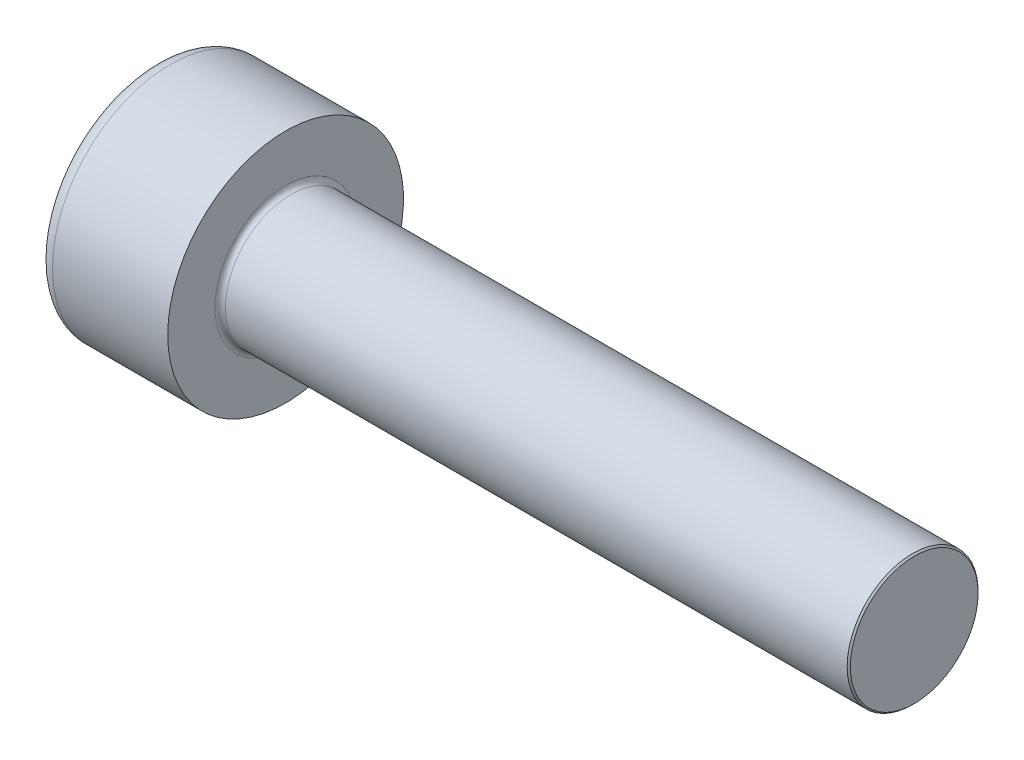
ISO-10303-21;
HEADER;
FILE_DESCRIPTION(('STEP AP214'),'2;1');
FILE_NAME('part.step','',(''),(''),'','','');
FILE_SCHEMA(('AUTOMOTIVE_DESIGN { 1 0 10303 214 1 1 1 1 }'));
ENDSEC;
DATA;
#1=APPLICATION_CONTEXT('core data for automotive mechanical design processes');
#2=APPLICATION_PROTOCOL_DEFINITION('international standard','automotive_design',2000,#1);
#3=PRODUCT_CONTEXT('',#1,'mechanical');
#4=PRODUCT('Part','Part','',(#3));
#5=PRODUCT_RELATED_PRODUCT_CATEGORY('part','',(#4));
#6=PRODUCT_DEFINITION_FORMATION('','',#4);
#7=PRODUCT_DEFINITION_CONTEXT('part definition',#1,'design');
#8=PRODUCT_DEFINITION('design','',#6,#7);
#9=PRODUCT_DEFINITION_SHAPE('','',#8);
#10=(LENGTH_UNIT() NAMED_UNIT(*) SI_UNIT(.MILLI.,.METRE.));
#11=(NAMED_UNIT(*) PLANE_ANGLE_UNIT() SI_UNIT($,.RADIAN.));
#12=(NAMED_UNIT(*) SI_UNIT($,.STERADIAN.) SOLID_ANGLE_UNIT());
#13=UNCERTAINTY_MEASURE_WITH_UNIT(LENGTH_MEASURE(1.E-05),#10,'distance_accuracy_value','');
#14=(GEOMETRIC_REPRESENTATION_CONTEXT(3) GLOBAL_UNCERTAINTY_ASSIGNED_CONTEXT((#13)) GLOBAL_UNIT_ASSIGNED_CONTEXT((#10,
#11,#12)) REPRESENTATION_CONTEXT('',''));
#15=CARTESIAN_POINT('',(0.,0.,0.));
#16=DIRECTION('',(0.,0.,1.));
#17=DIRECTION('',(1.,0.,0.));
#18=AXIS2_PLACEMENT_3D('',#15,#16,#17);
#19=CARTESIAN_POINT('',(0.,0.,0.));
#20=DIRECTION('',(-1.,0.,0.));
#21=DIRECTION('',(0.,0.,1.));
#22=AXIS2_PLACEMENT_3D('',#19,#20,#21);
#23=PLANE('',#22);
#24=DIRECTION('',(0.,-0.499999999999999,0.866025403784439));
#25=VECTOR('',#24,1.);
#26=CARTESIAN_POINT('',(0.,1.15470053837925,0.));
#27=LINE('',#26,#25);
#28=CARTESIAN_POINT('',(0.,1.15470053837925,0.));
#29=VERTEX_POINT('',#28);
#30=CARTESIAN_POINT('',(0.,0.577350269189622,0.999999999999997));
#31=VERTEX_POINT('',#30);
#32=EDGE_CURVE('E265',#29,#31,#27,.T.);
#33=ORIENTED_EDGE('',*,*,#32,.T.);
#34=DIRECTION('',(0.,1.,0.));
#35=VECTOR('',#34,1.);
#36=CARTESIAN_POINT('',(0.,-0.57735026918963,0.999999999999999));
#37=LINE('',#36,#35);
#38=CARTESIAN_POINT('',(0.,-0.57735026918963,0.999999999999999));
#39=VERTEX_POINT('',#38);
#40=EDGE_CURVE('E137',#39,#31,#37,.T.);
#41=ORIENTED_EDGE('',*,*,#40,.F.);
#42=DIRECTION('',(0.,-0.500000000000001,-0.866025403784438));
#43=VECTOR('',#42,1.);
#44=CARTESIAN_POINT('',(0.,-0.57735026918963,0.999999999999999));
#45=LINE('',#44,#43);
#46=CARTESIAN_POINT('',(0.,-1.15470053837926,0.));
#47=VERTEX_POINT('',#46);
#48=EDGE_CURVE('E268',#39,#47,#45,.T.);
#49=ORIENTED_EDGE('',*,*,#48,.T.);
#50=DIRECTION('',(0.,0.499999999999999,-0.866025403784439));
#51=VECTOR('',#50,1.);
#52=CARTESIAN_POINT('',(0.,-1.15470053837926,0.));
#53=LINE('',#52,#51);
#54=CARTESIAN_POINT('',(0.,-0.577350269189632,-1.));
#55=VERTEX_POINT('',#54);
#56=EDGE_CURVE('E271',#47,#55,#53,.T.);
#57=ORIENTED_EDGE('',*,*,#56,.T.);
#58=DIRECTION('',(0.,-1.,0.));
#59=VECTOR('',#58,1.);
#60=CARTESIAN_POINT('',(0.,0.577350269189619,-1.));
#61=LINE('',#60,#59);
#62=CARTESIAN_POINT('',(0.,0.577350269189619,-1.));
#63=VERTEX_POINT('',#62);
#64=EDGE_CURVE('E274',#63,#55,#61,.T.);
#65=ORIENTED_EDGE('',*,*,#64,.F.);
#66=DIRECTION('',(0.,-0.500000000000001,-0.866025403784438));
#67=VECTOR('',#66,1.);
#68=CARTESIAN_POINT('',(0.,1.15470053837925,0.));
#69=LINE('',#68,#67);
#70=EDGE_CURVE('E132',#29,#63,#69,.T.);
#71=ORIENTED_EDGE('',*,*,#70,.F.);
#72=EDGE_LOOP('',(#33,#41,#49,#57,#65,#71));
#73=FACE_BOUND('',#72,.T.);
#74=CARTESIAN_POINT('',(0.,0.,0.));
#75=DIRECTION('',(-1.,0.,0.));
#76=DIRECTION('',(0.,0.,1.));
#77=AXIS2_PLACEMENT_3D('',#74,#75,#76);
#78=CIRCLE('',#77,1.95);
#79=CARTESIAN_POINT('',(0.,0.,1.95));
#80=VERTEX_POINT('',#79);
#81=EDGE_CURVE('E49',#80,#80,#78,.T.);
#82=ORIENTED_EDGE('',*,*,#81,.T.);
#83=EDGE_LOOP('',(#82));
#84=FACE_BOUND('',#83,.T.);
#85=ADVANCED_FACE('F41',(#73,#84),#23,.T.);
#86=CARTESIAN_POINT('',(-31.75,0.,0.));
#87=DIRECTION('',(-1.,0.,0.));
#88=DIRECTION('',(0.,0.,1.));
#89=AXIS2_PLACEMENT_3D('',#86,#87,#88);
#90=CYLINDRICAL_SURFACE('',#89,2.25);
#91=CARTESIAN_POINT('',(0.300000000000002,0.,0.));
#92=DIRECTION('',(-1.,0.,0.));
#93=DIRECTION('',(0.,0.,1.));
#94=AXIS2_PLACEMENT_3D('',#91,#92,#93);
#95=CIRCLE('',#94,2.25);
#96=CARTESIAN_POINT('',(0.300000000000002,0.,2.25));
#97=VERTEX_POINT('',#96);
#98=EDGE_CURVE('E11',#97,#97,#95,.F.);
#99=ORIENTED_EDGE('',*,*,#98,.T.);
#100=EDGE_LOOP('',(#99));
#101=FACE_BOUND('',#100,.T.);
#102=CARTESIAN_POINT('',(2.5,0.,0.));
#103=DIRECTION('',(-1.,0.,0.));
#104=DIRECTION('',(0.,0.,1.));
#105=AXIS2_PLACEMENT_3D('',#102,#103,#104);
#106=CIRCLE('',#105,2.25);
#107=CARTESIAN_POINT('',(2.5,0.,2.25));
#108=VERTEX_POINT('',#107);
#109=EDGE_CURVE('E155',#108,#108,#106,.T.);
#110=ORIENTED_EDGE('',*,*,#109,.T.);
#111=EDGE_LOOP('',(#110));
#112=FACE_BOUND('',#111,.T.);
#113=ADVANCED_FACE('F180',(#101,#112),#90,.T.);
#114=CARTESIAN_POINT('',(2.5,2.25,0.));
#115=DIRECTION('',(1.,0.,0.));
#116=DIRECTION('',(0.,0.,-1.));
#117=AXIS2_PLACEMENT_3D('',#114,#115,#116);
#118=PLANE('',#117);
#119=CARTESIAN_POINT('',(2.5,0.,0.));
#120=DIRECTION('',(1.,0.,0.));
#121=DIRECTION('',(0.,0.,-1.));
#122=AXIS2_PLACEMENT_3D('',#119,#120,#121);
#123=CIRCLE('',#122,1.34999999999998);
#124=CARTESIAN_POINT('',(2.5,0.,-1.34999999999998));
#125=VERTEX_POINT('',#124);
#126=EDGE_CURVE('E158',#125,#125,#123,.F.);
#127=ORIENTED_EDGE('',*,*,#126,.T.);
#128=EDGE_LOOP('',(#127));
#129=FACE_BOUND('',#128,.T.);
#130=ORIENTED_EDGE('',*,*,#109,.F.);
#131=EDGE_LOOP('',(#130));
#132=FACE_BOUND('',#131,.T.);
#133=ADVANCED_FACE('F185',(#129,#132),#118,.T.);
#134=CARTESIAN_POINT('',(-31.75,0.,0.));
#135=DIRECTION('',(-1.,0.,0.));
#136=DIRECTION('',(0.,0.,1.));
#137=AXIS2_PLACEMENT_3D('',#134,#135,#136);
#138=CYLINDRICAL_SURFACE('',#137,1.24999999999998);
#139=CARTESIAN_POINT('',(2.6,0.,0.));
#140=DIRECTION('',(1.,0.,0.));
#141=DIRECTION('',(0.,0.,-1.));
#142=AXIS2_PLACEMENT_3D('',#139,#140,#141);
#143=CIRCLE('',#142,1.24999999999998);
#144=CARTESIAN_POINT('',(2.6,0.,-1.24999999999998));
#145=VERTEX_POINT('',#144);
#146=EDGE_CURVE('E161',#145,#145,#143,.T.);
#147=ORIENTED_EDGE('',*,*,#146,.T.);
#148=EDGE_LOOP('',(#147));
#149=FACE_BOUND('',#148,.T.);
#150=CARTESIAN_POINT('',(14.4695,0.,0.));
#151=DIRECTION('',(-1.,0.,0.));
#152=DIRECTION('',(0.,0.,1.));
#153=AXIS2_PLACEMENT_3D('',#150,#151,#152);
#154=CIRCLE('',#153,1.24999999999995);
#155=CARTESIAN_POINT('',(14.4695,0.,1.24999999999995));
#156=VERTEX_POINT('',#155);
#157=EDGE_CURVE('E152',#156,#156,#154,.T.);
#158=ORIENTED_EDGE('',*,*,#157,.T.);
#159=EDGE_LOOP('',(#158));
#160=FACE_BOUND('',#159,.T.);
#161=ADVANCED_FACE('F191',(#149,#160),#138,.T.);
#162=CARTESIAN_POINT('',(14.5,0.,0.));
#163=DIRECTION('',(-1.,0.,0.));
#164=DIRECTION('',(0.,0.,1.));
#165=AXIS2_PLACEMENT_3D('',#162,#163,#164);
#166=CONICAL_SURFACE('',#165,1.2195,0.785398163395916);
#167=ORIENTED_EDGE('',*,*,#157,.F.);
#168=EDGE_LOOP('',(#167));
#169=FACE_BOUND('',#168,.T.);
#170=CARTESIAN_POINT('',(14.5,0.,0.));
#171=DIRECTION('',(-1.,0.,0.));
#172=DIRECTION('',(0.,0.,1.));
#173=AXIS2_PLACEMENT_3D('',#170,#171,#172);
#174=CIRCLE('',#173,1.2195);
#175=CARTESIAN_POINT('',(14.5,0.,1.2195));
#176=VERTEX_POINT('',#175);
#177=EDGE_CURVE('E148',#176,#176,#174,.T.);
#178=ORIENTED_EDGE('',*,*,#177,.T.);
#179=EDGE_LOOP('',(#178));
#180=FACE_BOUND('',#179,.T.);
#181=ADVANCED_FACE('F195',(#169,#180),#166,.T.);
#182=CARTESIAN_POINT('',(14.5,1.2195,0.));
#183=DIRECTION('',(1.,0.,0.));
#184=DIRECTION('',(0.,0.,-1.));
#185=AXIS2_PLACEMENT_3D('',#182,#183,#184);
#186=PLANE('',#185);
#187=ORIENTED_EDGE('',*,*,#177,.F.);
#188=EDGE_LOOP('',(#187));
#189=FACE_BOUND('',#188,.T.);
#190=ADVANCED_FACE('F177',(#189),#186,.T.);
#191=CARTESIAN_POINT('',(2.6,0.,0.));
#192=DIRECTION('',(1.,0.,0.));
#193=DIRECTION('',(0.,0.,-1.));
#194=AXIS2_PLACEMENT_3D('',#191,#192,#193);
#195=TOROIDAL_SURFACE('',#194,1.34999999999998,0.1);
#196=ORIENTED_EDGE('',*,*,#146,.F.);
#197=EDGE_LOOP('',(#196));
#198=FACE_BOUND('',#197,.T.);
#199=ORIENTED_EDGE('',*,*,#126,.F.);
#200=EDGE_LOOP('',(#199));
#201=FACE_BOUND('',#200,.T.);
#202=ADVANCED_FACE('F168',(#198,#201),#195,.F.);
#203=CARTESIAN_POINT('',(0.300000000000002,0.,0.));
#204=DIRECTION('',(-1.,0.,0.));
#205=DIRECTION('',(0.,0.,1.));
#206=AXIS2_PLACEMENT_3D('',#203,#204,#205);
#207=TOROIDAL_SURFACE('',#206,1.95,0.3);
#208=ORIENTED_EDGE('',*,*,#98,.F.);
#209=EDGE_LOOP('',(#208));
#210=FACE_BOUND('',#209,.T.);
#211=ORIENTED_EDGE('',*,*,#81,.F.);
#212=EDGE_LOOP('',(#211));
#213=FACE_BOUND('',#212,.T.);
#214=ADVANCED_FACE('F43',(#210,#213),#207,.T.);
#215=CARTESIAN_POINT('',(1.3,1.15470053837925,0.));
#216=DIRECTION('',(0.,-0.866025403784439,-0.499999999999999));
#217=DIRECTION('',(0.,0.499999999999999,-0.866025403784439));
#218=AXIS2_PLACEMENT_3D('',#215,#216,#217);
#219=PLANE('',#218);
#220=ORIENTED_EDGE('',*,*,#32,.F.);
#221=DIRECTION('',(-1.,0.,0.));
#222=VECTOR('',#221,1.);
#223=CARTESIAN_POINT('',(1.3,1.15470053837925,0.));
#224=LINE('',#223,#222);
#225=CARTESIAN_POINT('',(1.3,1.15470053837925,0.));
#226=VERTEX_POINT('',#225);
#227=EDGE_CURVE('E255',#226,#29,#224,.T.);
#228=ORIENTED_EDGE('',*,*,#227,.F.);
#229=DIRECTION('',(0.,-0.499999999999999,0.866025403784439));
#230=VECTOR('',#229,1.);
#231=CARTESIAN_POINT('',(1.3,1.15470053837925,0.));
#232=LINE('',#231,#230);
#233=CARTESIAN_POINT('',(1.3,0.866025403784435,0.499999999999997));
#234=VERTEX_POINT('',#233);
#235=EDGE_CURVE('E124',#226,#234,#232,.T.);
#236=ORIENTED_EDGE('',*,*,#235,.T.);
#237=CARTESIAN_POINT('',(1.3,0.577350269189622,0.999999999999997));
#238=VERTEX_POINT('',#237);
#239=EDGE_CURVE('E115',#234,#238,#232,.T.);
#240=ORIENTED_EDGE('',*,*,#239,.T.);
#241=DIRECTION('',(-1.,0.,0.));
#242=VECTOR('',#241,1.);
#243=CARTESIAN_POINT('',(1.3,0.577350269189622,0.999999999999997));
#244=LINE('',#243,#242);
#245=EDGE_CURVE('E129',#238,#31,#244,.T.);
#246=ORIENTED_EDGE('',*,*,#245,.T.);
#247=EDGE_LOOP('',(#220,#228,#236,#240,#246));
#248=FACE_BOUND('',#247,.T.);
#249=ADVANCED_FACE('F128',(#248),#219,.T.);
#250=CARTESIAN_POINT('',(1.3,-0.57735026918963,0.999999999999999));
#251=DIRECTION('',(0.,0.,1.));
#252=DIRECTION('',(0.,-1.,0.));
#253=AXIS2_PLACEMENT_3D('',#250,#251,#252);
#254=PLANE('',#253);
#255=ORIENTED_EDGE('',*,*,#40,.T.);
#256=ORIENTED_EDGE('',*,*,#245,.F.);
#257=DIRECTION('',(0.,1.,0.));
#258=VECTOR('',#257,1.);
#259=CARTESIAN_POINT('',(1.3,-0.57735026918963,0.999999999999999));
#260=LINE('',#259,#258);
#261=CARTESIAN_POINT('',(1.3,0.,0.999999999999998));
#262=VERTEX_POINT('',#261);
#263=EDGE_CURVE('E112',#262,#238,#260,.T.);
#264=ORIENTED_EDGE('',*,*,#263,.F.);
#265=CARTESIAN_POINT('',(1.3,-0.57735026918963,0.999999999999999));
#266=VERTEX_POINT('',#265);
#267=EDGE_CURVE('E123',#266,#262,#260,.T.);
#268=ORIENTED_EDGE('',*,*,#267,.F.);
#269=DIRECTION('',(-1.,0.,0.));
#270=VECTOR('',#269,1.);
#271=CARTESIAN_POINT('',(1.3,-0.57735026918963,0.999999999999999));
#272=LINE('',#271,#270);
#273=EDGE_CURVE('E139',#266,#39,#272,.T.);
#274=ORIENTED_EDGE('',*,*,#273,.T.);
#275=EDGE_LOOP('',(#255,#256,#264,#268,#274));
#276=FACE_BOUND('',#275,.T.);
#277=ADVANCED_FACE('F134',(#276),#254,.F.);
#278=CARTESIAN_POINT('',(1.3,-0.57735026918963,0.999999999999999));
#279=DIRECTION('',(0.,0.866025403784438,-0.500000000000001));
#280=DIRECTION('',(0.,0.500000000000001,0.866025403784438));
#281=AXIS2_PLACEMENT_3D('',#278,#279,#280);
#282=PLANE('',#281);
#283=ORIENTED_EDGE('',*,*,#48,.F.);
#284=ORIENTED_EDGE('',*,*,#273,.F.);
#285=DIRECTION('',(0.,-0.500000000000001,-0.866025403784438));
#286=VECTOR('',#285,1.);
#287=CARTESIAN_POINT('',(1.3,-0.57735026918963,0.999999999999999));
#288=LINE('',#287,#286);
#289=CARTESIAN_POINT('',(1.3,-0.866025403784441,0.500000000000003));
#290=VERTEX_POINT('',#289);
#291=EDGE_CURVE('E294',#266,#290,#288,.T.);
#292=ORIENTED_EDGE('',*,*,#291,.T.);
#293=CARTESIAN_POINT('',(1.3,-1.15470053837926,0.));
#294=VERTEX_POINT('',#293);
#295=EDGE_CURVE('E283',#290,#294,#288,.T.);
#296=ORIENTED_EDGE('',*,*,#295,.T.);
#297=DIRECTION('',(-1.,0.,0.));
#298=VECTOR('',#297,1.);
#299=CARTESIAN_POINT('',(1.3,-1.15470053837926,0.));
#300=LINE('',#299,#298);
#301=EDGE_CURVE('E144',#294,#47,#300,.T.);
#302=ORIENTED_EDGE('',*,*,#301,.T.);
#303=EDGE_LOOP('',(#283,#284,#292,#296,#302));
#304=FACE_BOUND('',#303,.T.);
#305=ADVANCED_FACE('F209',(#304),#282,.T.);
#306=CARTESIAN_POINT('',(1.3,-1.15470053837926,0.));
#307=DIRECTION('',(0.,0.866025403784439,0.499999999999999));
#308=DIRECTION('',(0.,-0.499999999999999,0.866025403784439));
#309=AXIS2_PLACEMENT_3D('',#306,#307,#308);
#310=PLANE('',#309);
#311=ORIENTED_EDGE('',*,*,#56,.F.);
#312=ORIENTED_EDGE('',*,*,#301,.F.);
#313=DIRECTION('',(0.,0.499999999999999,-0.866025403784439));
#314=VECTOR('',#313,1.);
#315=CARTESIAN_POINT('',(1.3,-1.15470053837926,0.));
#316=LINE('',#315,#314);
#317=CARTESIAN_POINT('',(1.3,-0.866025403784444,-0.500000000000002));
#318=VERTEX_POINT('',#317);
#319=EDGE_CURVE('E261',#294,#318,#316,.T.);
#320=ORIENTED_EDGE('',*,*,#319,.T.);
#321=CARTESIAN_POINT('',(1.3,-0.577350269189632,-1.));
#322=VERTEX_POINT('',#321);
#323=EDGE_CURVE('E293',#318,#322,#316,.T.);
#324=ORIENTED_EDGE('',*,*,#323,.T.);
#325=DIRECTION('',(-1.,0.,0.));
#326=VECTOR('',#325,1.);
#327=CARTESIAN_POINT('',(1.3,-0.577350269189632,-1.));
#328=LINE('',#327,#326);
#329=EDGE_CURVE('E254',#322,#55,#328,.T.);
#330=ORIENTED_EDGE('',*,*,#329,.T.);
#331=EDGE_LOOP('',(#311,#312,#320,#324,#330));
#332=FACE_BOUND('',#331,.T.);
#333=ADVANCED_FACE('F212',(#332),#310,.T.);
#334=CARTESIAN_POINT('',(1.3,0.577350269189619,-1.));
#335=DIRECTION('',(0.,0.,-1.));
#336=DIRECTION('',(0.,1.,0.));
#337=AXIS2_PLACEMENT_3D('',#334,#335,#336);
#338=PLANE('',#337);
#339=ORIENTED_EDGE('',*,*,#64,.T.);
#340=ORIENTED_EDGE('',*,*,#329,.F.);
#341=DIRECTION('',(0.,-1.,0.));
#342=VECTOR('',#341,1.);
#343=CARTESIAN_POINT('',(1.3,0.577350269189619,-1.));
#344=LINE('',#343,#342);
#345=CARTESIAN_POINT('',(1.3,0.,-1.));
#346=VERTEX_POINT('',#345);
#347=EDGE_CURVE('E258',#346,#322,#344,.T.);
#348=ORIENTED_EDGE('',*,*,#347,.F.);
#349=CARTESIAN_POINT('',(1.3,0.577350269189619,-1.));
#350=VERTEX_POINT('',#349);
#351=EDGE_CURVE('E56',#350,#346,#344,.T.);
#352=ORIENTED_EDGE('',*,*,#351,.F.);
#353=DIRECTION('',(-1.,0.,0.));
#354=VECTOR('',#353,1.);
#355=CARTESIAN_POINT('',(1.3,0.577350269189619,-1.));
#356=LINE('',#355,#354);
#357=EDGE_CURVE('E251',#350,#63,#356,.T.);
#358=ORIENTED_EDGE('',*,*,#357,.T.);
#359=EDGE_LOOP('',(#339,#340,#348,#352,#358));
#360=FACE_BOUND('',#359,.T.);
#361=ADVANCED_FACE('F216',(#360),#338,.F.);
#362=CARTESIAN_POINT('',(1.3,1.15470053837925,0.));
#363=DIRECTION('',(0.,0.866025403784438,-0.500000000000001));
#364=DIRECTION('',(0.,0.500000000000001,0.866025403784438));
#365=AXIS2_PLACEMENT_3D('',#362,#363,#364);
#366=PLANE('',#365);
#367=ORIENTED_EDGE('',*,*,#70,.T.);
#368=ORIENTED_EDGE('',*,*,#357,.F.);
#369=DIRECTION('',(0.,-0.500000000000001,-0.866025403784438));
#370=VECTOR('',#369,1.);
#371=CARTESIAN_POINT('',(1.3,1.15470053837925,0.));
#372=LINE('',#371,#370);
#373=CARTESIAN_POINT('',(1.3,0.866025403784435,-0.5));
#374=VERTEX_POINT('',#373);
#375=EDGE_CURVE('E241',#374,#350,#372,.T.);
#376=ORIENTED_EDGE('',*,*,#375,.F.);
#377=EDGE_CURVE('E247',#226,#374,#372,.T.);
#378=ORIENTED_EDGE('',*,*,#377,.F.);
#379=ORIENTED_EDGE('',*,*,#227,.T.);
#380=EDGE_LOOP('',(#367,#368,#376,#378,#379));
#381=FACE_BOUND('',#380,.T.);
#382=ADVANCED_FACE('F220',(#381),#366,.F.);
#383=CARTESIAN_POINT('',(1.3,1.15470053837925,0.));
#384=DIRECTION('',(1.,0.,0.));
#385=DIRECTION('',(0.,0.,-1.));
#386=AXIS2_PLACEMENT_3D('',#383,#384,#385);
#387=PLANE('',#386);
#388=ORIENTED_EDGE('',*,*,#347,.T.);
#389=ORIENTED_EDGE('',*,*,#323,.F.);
#390=CARTESIAN_POINT('',(1.3,0.,0.));
#391=DIRECTION('',(-1.,0.,0.));
#392=DIRECTION('',(0.,0.,1.));
#393=AXIS2_PLACEMENT_3D('',#390,#391,#392);
#394=CIRCLE('',#393,1.);
#395=EDGE_CURVE('E289',#346,#318,#394,.T.);
#396=ORIENTED_EDGE('',*,*,#395,.F.);
#397=EDGE_LOOP('',(#388,#389,#396));
#398=FACE_BOUND('',#397,.T.);
#399=ADVANCED_FACE('F224',(#398),#387,.F.);
#400=ORIENTED_EDGE('',*,*,#319,.F.);
#401=ORIENTED_EDGE('',*,*,#295,.F.);
#402=EDGE_CURVE('E142',#318,#290,#394,.T.);
#403=ORIENTED_EDGE('',*,*,#402,.F.);
#404=EDGE_LOOP('',(#400,#401,#403));
#405=FACE_BOUND('',#404,.T.);
#406=ADVANCED_FACE('F227',(#405),#387,.F.);
#407=ORIENTED_EDGE('',*,*,#291,.F.);
#408=ORIENTED_EDGE('',*,*,#267,.T.);
#409=EDGE_CURVE('E138',#290,#262,#394,.T.);
#410=ORIENTED_EDGE('',*,*,#409,.F.);
#411=EDGE_LOOP('',(#407,#408,#410));
#412=FACE_BOUND('',#411,.T.);
#413=ADVANCED_FACE('F232',(#412),#387,.F.);
#414=ORIENTED_EDGE('',*,*,#263,.T.);
#415=ORIENTED_EDGE('',*,*,#239,.F.);
#416=EDGE_CURVE('E118',#262,#234,#394,.T.);
#417=ORIENTED_EDGE('',*,*,#416,.F.);
#418=EDGE_LOOP('',(#414,#415,#417));
#419=FACE_BOUND('',#418,.T.);
#420=ADVANCED_FACE('F114',(#419),#387,.F.);
#421=ORIENTED_EDGE('',*,*,#235,.F.);
#422=ORIENTED_EDGE('',*,*,#377,.T.);
#423=EDGE_CURVE('E149',#234,#374,#394,.T.);
#424=ORIENTED_EDGE('',*,*,#423,.F.);
#425=EDGE_LOOP('',(#421,#422,#424));
#426=FACE_BOUND('',#425,.T.);
#427=ADVANCED_FACE('F235',(#426),#387,.F.);
#428=ORIENTED_EDGE('',*,*,#375,.T.);
#429=ORIENTED_EDGE('',*,*,#351,.T.);
#430=EDGE_CURVE('E244',#374,#346,#394,.T.);
#431=ORIENTED_EDGE('',*,*,#430,.F.);
#432=EDGE_LOOP('',(#428,#429,#431));
#433=FACE_BOUND('',#432,.T.);
#434=ADVANCED_FACE('F205',(#433),#387,.F.);
#435=CARTESIAN_POINT('',(1.3,0.,0.));
#436=DIRECTION('',(-1.,0.,0.));
#437=DIRECTION('',(0.,0.,1.));
#438=AXIS2_PLACEMENT_3D('',#435,#436,#437);
#439=CONICAL_SURFACE('',#438,1.,1.04719755119659);
#440=CARTESIAN_POINT('',(1.87735026918964,0.,0.));
#441=VERTEX_POINT('',#440);
#442=VERTEX_LOOP('',#441);
#443=FACE_BOUND('',#442,.T.);
#444=ORIENTED_EDGE('',*,*,#416,.T.);
#445=ORIENTED_EDGE('',*,*,#423,.T.);
#446=ORIENTED_EDGE('',*,*,#430,.T.);
#447=ORIENTED_EDGE('',*,*,#395,.T.);
#448=ORIENTED_EDGE('',*,*,#402,.T.);
#449=ORIENTED_EDGE('',*,*,#409,.T.);
#450=EDGE_LOOP('',(#444,#445,#446,#447,#448,#449));
#451=FACE_BOUND('',#450,.T.);
#452=ADVANCED_FACE('F203',(#443,#451),#439,.F.);
#453=CLOSED_SHELL('',(#85,#113,#133,#161,#181,#190,#202,#214,#249,#277,#305,#333,#361,#382,#399,
#406,#413,#420,#427,#434,#452));
#454=MANIFOLD_SOLID_BREP('B2',#453);
#455=ADVANCED_BREP_SHAPE_REPRESENTATION('',(#18,#454),#14);
#456=SHAPE_DEFINITION_REPRESENTATION(#9,#455);
ENDSEC;
END-ISO-10303-21;
